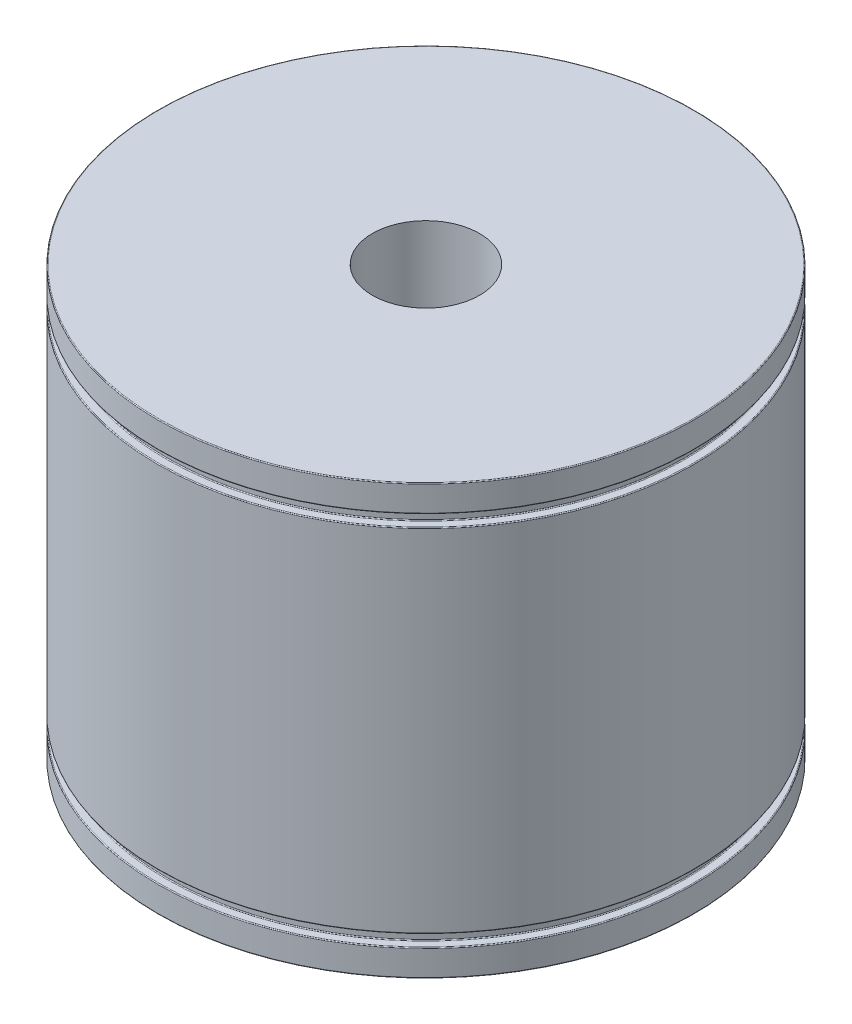
ISO-10303-21;
HEADER;
FILE_DESCRIPTION(('STEP AP214'),'2;1');
FILE_NAME('part.step','',(''),(''),'','','');
FILE_SCHEMA(('AUTOMOTIVE_DESIGN { 1 0 10303 214 1 1 1 1 }'));
ENDSEC;
DATA;
#1=APPLICATION_CONTEXT('core data for automotive mechanical design processes');
#2=APPLICATION_PROTOCOL_DEFINITION('international standard','automotive_design',2000,#1);
#3=PRODUCT_CONTEXT('',#1,'mechanical');
#4=PRODUCT('Part','Part','',(#3));
#5=PRODUCT_RELATED_PRODUCT_CATEGORY('part','',(#4));
#6=PRODUCT_DEFINITION_FORMATION('','',#4);
#7=PRODUCT_DEFINITION_CONTEXT('part definition',#1,'design');
#8=PRODUCT_DEFINITION('design','',#6,#7);
#9=PRODUCT_DEFINITION_SHAPE('','',#8);
#10=(LENGTH_UNIT() NAMED_UNIT(*) SI_UNIT(.MILLI.,.METRE.));
#11=(NAMED_UNIT(*) PLANE_ANGLE_UNIT() SI_UNIT($,.RADIAN.));
#12=(NAMED_UNIT(*) SI_UNIT($,.STERADIAN.) SOLID_ANGLE_UNIT());
#13=UNCERTAINTY_MEASURE_WITH_UNIT(LENGTH_MEASURE(1.E-05),#10,'distance_accuracy_value','');
#14=(GEOMETRIC_REPRESENTATION_CONTEXT(3) GLOBAL_UNCERTAINTY_ASSIGNED_CONTEXT((#13)) GLOBAL_UNIT_ASSIGNED_CONTEXT((#10,
#11,#12)) REPRESENTATION_CONTEXT('',''));
#15=CARTESIAN_POINT('',(0.,0.,0.));
#16=DIRECTION('',(0.,0.,1.));
#17=DIRECTION('',(1.,0.,0.));
#18=AXIS2_PLACEMENT_3D('',#15,#16,#17);
#19=CARTESIAN_POINT('',(6.35000000000001,25.4,0.));
#20=DIRECTION('',(0.,-1.,0.));
#21=DIRECTION('',(0.,0.,-1.));
#22=AXIS2_PLACEMENT_3D('',#19,#20,#21);
#23=PLANE('',#22);
#24=CARTESIAN_POINT('',(0.,25.4,0.));
#25=DIRECTION('',(0.,1.,0.));
#26=DIRECTION('',(0.,0.,1.));
#27=AXIS2_PLACEMENT_3D('',#24,#25,#26);
#28=CIRCLE('',#27,6.35000000000001);
#29=CARTESIAN_POINT('',(0.,25.4,6.35000000000001));
#30=VERTEX_POINT('',#29);
#31=EDGE_CURVE('E111',#30,#30,#28,.T.);
#32=ORIENTED_EDGE('',*,*,#31,.F.);
#33=EDGE_LOOP('',(#32));
#34=FACE_BOUND('',#33,.T.);
#35=CARTESIAN_POINT('',(0.,25.4,0.));
#36=DIRECTION('',(0.,1.,0.));
#37=DIRECTION('',(0.,0.,1.));
#38=AXIS2_PLACEMENT_3D('',#35,#36,#37);
#39=CIRCLE('',#38,31.65);
#40=CARTESIAN_POINT('',(0.,25.4,31.65));
#41=VERTEX_POINT('',#40);
#42=EDGE_CURVE('E12',#41,#41,#39,.T.);
#43=ORIENTED_EDGE('',*,*,#42,.T.);
#44=EDGE_LOOP('',(#43));
#45=FACE_BOUND('',#44,.T.);
#46=ADVANCED_FACE('F41',(#34,#45),#23,.F.);
#47=CARTESIAN_POINT('',(0.,25.3,0.));
#48=DIRECTION('',(0.,1.,0.));
#49=DIRECTION('',(0.,0.,1.));
#50=AXIS2_PLACEMENT_3D('',#47,#48,#49);
#51=TOROIDAL_SURFACE('',#50,31.65,0.100000000000001);
#52=ORIENTED_EDGE('',*,*,#42,.F.);
#53=EDGE_LOOP('',(#52));
#54=FACE_BOUND('',#53,.T.);
#55=CARTESIAN_POINT('',(0.,25.3,0.));
#56=DIRECTION('',(0.,1.,0.));
#57=DIRECTION('',(0.,0.,1.));
#58=AXIS2_PLACEMENT_3D('',#55,#56,#57);
#59=CIRCLE('',#58,31.75);
#60=CARTESIAN_POINT('',(0.,25.3,31.75));
#61=VERTEX_POINT('',#60);
#62=EDGE_CURVE('E47',#61,#61,#59,.T.);
#63=ORIENTED_EDGE('',*,*,#62,.T.);
#64=EDGE_LOOP('',(#63));
#65=FACE_BOUND('',#64,.T.);
#66=ADVANCED_FACE('F118',(#54,#65),#51,.T.);
#67=CARTESIAN_POINT('',(0.,25.4,0.));
#68=DIRECTION('',(0.,1.,0.));
#69=DIRECTION('',(0.,0.,1.));
#70=AXIS2_PLACEMENT_3D('',#67,#68,#69);
#71=CYLINDRICAL_SURFACE('',#70,31.75);
#72=ORIENTED_EDGE('',*,*,#62,.F.);
#73=EDGE_LOOP('',(#72));
#74=FACE_BOUND('',#73,.T.);
#75=CARTESIAN_POINT('',(0.,22.3332876802199,0.));
#76=DIRECTION('',(0.,1.,0.));
#77=DIRECTION('',(0.,0.,1.));
#78=AXIS2_PLACEMENT_3D('',#75,#76,#77);
#79=CIRCLE('',#78,31.75);
#80=CARTESIAN_POINT('',(0.,22.3332876802199,31.75));
#81=VERTEX_POINT('',#80);
#82=EDGE_CURVE('E51',#81,#81,#79,.T.);
#83=ORIENTED_EDGE('',*,*,#82,.T.);
#84=EDGE_LOOP('',(#83));
#85=FACE_BOUND('',#84,.T.);
#86=ADVANCED_FACE('F122',(#74,#85),#71,.T.);
#87=CARTESIAN_POINT('',(0.,22.3332876802199,0.));
#88=DIRECTION('',(0.,1.,0.));
#89=DIRECTION('',(0.,0.,1.));
#90=AXIS2_PLACEMENT_3D('',#87,#88,#89);
#91=TOROIDAL_SURFACE('',#90,31.65,0.0999999999999977);
#92=ORIENTED_EDGE('',*,*,#82,.F.);
#93=EDGE_LOOP('',(#92));
#94=FACE_BOUND('',#93,.T.);
#95=CARTESIAN_POINT('',(0.,22.2332876802199,0.));
#96=DIRECTION('',(0.,1.,0.));
#97=DIRECTION('',(0.,0.,1.));
#98=AXIS2_PLACEMENT_3D('',#95,#96,#97);
#99=CIRCLE('',#98,31.65);
#100=CARTESIAN_POINT('',(0.,22.2332876802199,31.65));
#101=VERTEX_POINT('',#100);
#102=EDGE_CURVE('E55',#101,#101,#99,.T.);
#103=ORIENTED_EDGE('',*,*,#102,.T.);
#104=EDGE_LOOP('',(#103));
#105=FACE_BOUND('',#104,.T.);
#106=ADVANCED_FACE('F127',(#94,#105),#91,.T.);
#107=CARTESIAN_POINT('',(31.65,22.2332876802199,0.));
#108=DIRECTION('',(0.,1.,0.));
#109=DIRECTION('',(0.,0.,1.));
#110=AXIS2_PLACEMENT_3D('',#107,#108,#109);
#111=PLANE('',#110);
#112=ORIENTED_EDGE('',*,*,#102,.F.);
#113=EDGE_LOOP('',(#112));
#114=FACE_BOUND('',#113,.T.);
#115=CARTESIAN_POINT('',(0.,22.2332876802199,0.));
#116=DIRECTION('',(0.,1.,0.));
#117=DIRECTION('',(0.,0.,1.));
#118=AXIS2_PLACEMENT_3D('',#115,#116,#117);
#119=CIRCLE('',#118,30.7986025440302);
#120=CARTESIAN_POINT('',(0.,22.2332876802199,30.7986025440302));
#121=VERTEX_POINT('',#120);
#122=EDGE_CURVE('E60',#121,#121,#119,.T.);
#123=ORIENTED_EDGE('',*,*,#122,.T.);
#124=EDGE_LOOP('',(#123));
#125=FACE_BOUND('',#124,.T.);
#126=ADVANCED_FACE('F133',(#114,#125),#111,.F.);
#127=CARTESIAN_POINT('',(0.,22.1332876802199,0.));
#128=DIRECTION('',(0.,1.,0.));
#129=DIRECTION('',(0.,0.,1.));
#130=AXIS2_PLACEMENT_3D('',#127,#128,#129);
#131=TOROIDAL_SURFACE('',#130,30.7986025440302,0.0999999999999959);
#132=ORIENTED_EDGE('',*,*,#122,.F.);
#133=EDGE_LOOP('',(#132));
#134=FACE_BOUND('',#133,.T.);
#135=CARTESIAN_POINT('',(0.,22.1332876802199,0.));
#136=DIRECTION('',(0.,1.,0.));
#137=DIRECTION('',(0.,0.,1.));
#138=AXIS2_PLACEMENT_3D('',#135,#136,#137);
#139=CIRCLE('',#138,30.6986025440302);
#140=CARTESIAN_POINT('',(0.,22.1332876802199,30.6986025440302));
#141=VERTEX_POINT('',#140);
#142=EDGE_CURVE('E63',#141,#141,#139,.T.);
#143=ORIENTED_EDGE('',*,*,#142,.T.);
#144=EDGE_LOOP('',(#143));
#145=FACE_BOUND('',#144,.T.);
#146=ADVANCED_FACE('F137',(#134,#145),#131,.F.);
#147=CARTESIAN_POINT('',(0.,25.4,0.));
#148=DIRECTION('',(0.,1.,0.));
#149=DIRECTION('',(0.,0.,1.));
#150=AXIS2_PLACEMENT_3D('',#147,#148,#149);
#151=CYLINDRICAL_SURFACE('',#150,30.6986025440302);
#152=ORIENTED_EDGE('',*,*,#142,.F.);
#153=EDGE_LOOP('',(#152));
#154=FACE_BOUND('',#153,.T.);
#155=CARTESIAN_POINT('',(0.,20.9361946855747,0.));
#156=DIRECTION('',(0.,1.,0.));
#157=DIRECTION('',(0.,0.,1.));
#158=AXIS2_PLACEMENT_3D('',#155,#156,#157);
#159=CIRCLE('',#158,30.6986025440302);
#160=CARTESIAN_POINT('',(0.,20.9361946855747,30.6986025440302));
#161=VERTEX_POINT('',#160);
#162=EDGE_CURVE('E66',#161,#161,#159,.T.);
#163=ORIENTED_EDGE('',*,*,#162,.T.);
#164=EDGE_LOOP('',(#163));
#165=FACE_BOUND('',#164,.T.);
#166=ADVANCED_FACE('F141',(#154,#165),#151,.T.);
#167=CARTESIAN_POINT('',(0.,20.9361946855747,0.));
#168=DIRECTION('',(0.,1.,0.));
#169=DIRECTION('',(0.,0.,1.));
#170=AXIS2_PLACEMENT_3D('',#167,#168,#169);
#171=TOROIDAL_SURFACE('',#170,30.7986025440302,0.100000000000001);
#172=ORIENTED_EDGE('',*,*,#162,.F.);
#173=EDGE_LOOP('',(#172));
#174=FACE_BOUND('',#173,.T.);
#175=CARTESIAN_POINT('',(0.,20.8361946855747,0.));
#176=DIRECTION('',(0.,1.,0.));
#177=DIRECTION('',(0.,0.,1.));
#178=AXIS2_PLACEMENT_3D('',#175,#176,#177);
#179=CIRCLE('',#178,30.7986025440302);
#180=CARTESIAN_POINT('',(0.,20.8361946855747,30.7986025440302));
#181=VERTEX_POINT('',#180);
#182=EDGE_CURVE('E69',#181,#181,#179,.T.);
#183=ORIENTED_EDGE('',*,*,#182,.T.);
#184=EDGE_LOOP('',(#183));
#185=FACE_BOUND('',#184,.T.);
#186=ADVANCED_FACE('F145',(#174,#185),#171,.F.);
#187=CARTESIAN_POINT('',(30.7986025440302,20.8361946855747,0.));
#188=DIRECTION('',(0.,-1.,0.));
#189=DIRECTION('',(0.,0.,-1.));
#190=AXIS2_PLACEMENT_3D('',#187,#188,#189);
#191=PLANE('',#190);
#192=ORIENTED_EDGE('',*,*,#182,.F.);
#193=EDGE_LOOP('',(#192));
#194=FACE_BOUND('',#193,.T.);
#195=CARTESIAN_POINT('',(0.,20.8361946855747,0.));
#196=DIRECTION('',(0.,1.,0.));
#197=DIRECTION('',(0.,0.,1.));
#198=AXIS2_PLACEMENT_3D('',#195,#196,#197);
#199=CIRCLE('',#198,31.65);
#200=CARTESIAN_POINT('',(0.,20.8361946855747,31.65));
#201=VERTEX_POINT('',#200);
#202=EDGE_CURVE('E72',#201,#201,#199,.T.);
#203=ORIENTED_EDGE('',*,*,#202,.T.);
#204=EDGE_LOOP('',(#203));
#205=FACE_BOUND('',#204,.T.);
#206=ADVANCED_FACE('F149',(#194,#205),#191,.F.);
#207=CARTESIAN_POINT('',(0.,20.7361946855747,0.));
#208=DIRECTION('',(0.,1.,0.));
#209=DIRECTION('',(0.,0.,1.));
#210=AXIS2_PLACEMENT_3D('',#207,#208,#209);
#211=TOROIDAL_SURFACE('',#210,31.65,0.0999999999999977);
#212=ORIENTED_EDGE('',*,*,#202,.F.);
#213=EDGE_LOOP('',(#212));
#214=FACE_BOUND('',#213,.T.);
#215=CARTESIAN_POINT('',(0.,20.7361946855747,0.));
#216=DIRECTION('',(0.,1.,0.));
#217=DIRECTION('',(0.,0.,1.));
#218=AXIS2_PLACEMENT_3D('',#215,#216,#217);
#219=CIRCLE('',#218,31.75);
#220=CARTESIAN_POINT('',(0.,20.7361946855747,31.75));
#221=VERTEX_POINT('',#220);
#222=EDGE_CURVE('E75',#221,#221,#219,.T.);
#223=ORIENTED_EDGE('',*,*,#222,.T.);
#224=EDGE_LOOP('',(#223));
#225=FACE_BOUND('',#224,.T.);
#226=ADVANCED_FACE('F153',(#214,#225),#211,.T.);
#227=CARTESIAN_POINT('',(0.,25.4,0.));
#228=DIRECTION('',(0.,1.,0.));
#229=DIRECTION('',(0.,0.,1.));
#230=AXIS2_PLACEMENT_3D('',#227,#228,#229);
#231=CYLINDRICAL_SURFACE('',#230,31.75);
#232=ORIENTED_EDGE('',*,*,#222,.F.);
#233=EDGE_LOOP('',(#232));
#234=FACE_BOUND('',#233,.T.);
#235=CARTESIAN_POINT('',(0.,-20.7361946855747,0.));
#236=DIRECTION('',(0.,1.,0.));
#237=DIRECTION('',(0.,0.,1.));
#238=AXIS2_PLACEMENT_3D('',#235,#236,#237);
#239=CIRCLE('',#238,31.75);
#240=CARTESIAN_POINT('',(0.,-20.7361946855747,31.75));
#241=VERTEX_POINT('',#240);
#242=EDGE_CURVE('E78',#241,#241,#239,.T.);
#243=ORIENTED_EDGE('',*,*,#242,.T.);
#244=EDGE_LOOP('',(#243));
#245=FACE_BOUND('',#244,.T.);
#246=ADVANCED_FACE('F157',(#234,#245),#231,.T.);
#247=CARTESIAN_POINT('',(0.,-20.7361946855747,0.));
#248=DIRECTION('',(0.,1.,0.));
#249=DIRECTION('',(0.,0.,1.));
#250=AXIS2_PLACEMENT_3D('',#247,#248,#249);
#251=TOROIDAL_SURFACE('',#250,31.65,0.0999999999999977);
#252=ORIENTED_EDGE('',*,*,#242,.F.);
#253=EDGE_LOOP('',(#252));
#254=FACE_BOUND('',#253,.T.);
#255=CARTESIAN_POINT('',(0.,-20.8361946855747,0.));
#256=DIRECTION('',(0.,1.,0.));
#257=DIRECTION('',(0.,0.,1.));
#258=AXIS2_PLACEMENT_3D('',#255,#256,#257);
#259=CIRCLE('',#258,31.65);
#260=CARTESIAN_POINT('',(0.,-20.8361946855747,31.65));
#261=VERTEX_POINT('',#260);
#262=EDGE_CURVE('E81',#261,#261,#259,.T.);
#263=ORIENTED_EDGE('',*,*,#262,.T.);
#264=EDGE_LOOP('',(#263));
#265=FACE_BOUND('',#264,.T.);
#266=ADVANCED_FACE('F161',(#254,#265),#251,.T.);
#267=CARTESIAN_POINT('',(30.7986025440302,-20.8361946855747,0.));
#268=DIRECTION('',(0.,1.,0.));
#269=DIRECTION('',(0.,0.,1.));
#270=AXIS2_PLACEMENT_3D('',#267,#268,#269);
#271=PLANE('',#270);
#272=ORIENTED_EDGE('',*,*,#262,.F.);
#273=EDGE_LOOP('',(#272));
#274=FACE_BOUND('',#273,.T.);
#275=CARTESIAN_POINT('',(0.,-20.8361946855747,0.));
#276=DIRECTION('',(0.,1.,0.));
#277=DIRECTION('',(0.,0.,1.));
#278=AXIS2_PLACEMENT_3D('',#275,#276,#277);
#279=CIRCLE('',#278,30.7986025440302);
#280=CARTESIAN_POINT('',(0.,-20.8361946855747,30.7986025440302));
#281=VERTEX_POINT('',#280);
#282=EDGE_CURVE('E84',#281,#281,#279,.T.);
#283=ORIENTED_EDGE('',*,*,#282,.T.);
#284=EDGE_LOOP('',(#283));
#285=FACE_BOUND('',#284,.T.);
#286=ADVANCED_FACE('F165',(#274,#285),#271,.F.);
#287=CARTESIAN_POINT('',(0.,-20.9361946855747,0.));
#288=DIRECTION('',(0.,1.,0.));
#289=DIRECTION('',(0.,0.,1.));
#290=AXIS2_PLACEMENT_3D('',#287,#288,#289);
#291=TOROIDAL_SURFACE('',#290,30.7986025440302,0.100000000000001);
#292=ORIENTED_EDGE('',*,*,#282,.F.);
#293=EDGE_LOOP('',(#292));
#294=FACE_BOUND('',#293,.T.);
#295=CARTESIAN_POINT('',(0.,-20.9361946855747,0.));
#296=DIRECTION('',(0.,1.,0.));
#297=DIRECTION('',(0.,0.,1.));
#298=AXIS2_PLACEMENT_3D('',#295,#296,#297);
#299=CIRCLE('',#298,30.6986025440302);
#300=CARTESIAN_POINT('',(0.,-20.9361946855747,30.6986025440302));
#301=VERTEX_POINT('',#300);
#302=EDGE_CURVE('E87',#301,#301,#299,.T.);
#303=ORIENTED_EDGE('',*,*,#302,.T.);
#304=EDGE_LOOP('',(#303));
#305=FACE_BOUND('',#304,.T.);
#306=ADVANCED_FACE('F169',(#294,#305),#291,.F.);
#307=CARTESIAN_POINT('',(0.,25.4,0.));
#308=DIRECTION('',(0.,1.,0.));
#309=DIRECTION('',(0.,0.,1.));
#310=AXIS2_PLACEMENT_3D('',#307,#308,#309);
#311=CYLINDRICAL_SURFACE('',#310,30.6986025440302);
#312=ORIENTED_EDGE('',*,*,#302,.F.);
#313=EDGE_LOOP('',(#312));
#314=FACE_BOUND('',#313,.T.);
#315=CARTESIAN_POINT('',(0.,-22.1332876802199,0.));
#316=DIRECTION('',(0.,1.,0.));
#317=DIRECTION('',(0.,0.,1.));
#318=AXIS2_PLACEMENT_3D('',#315,#316,#317);
#319=CIRCLE('',#318,30.6986025440302);
#320=CARTESIAN_POINT('',(0.,-22.1332876802199,30.6986025440302));
#321=VERTEX_POINT('',#320);
#322=EDGE_CURVE('E90',#321,#321,#319,.T.);
#323=ORIENTED_EDGE('',*,*,#322,.T.);
#324=EDGE_LOOP('',(#323));
#325=FACE_BOUND('',#324,.T.);
#326=ADVANCED_FACE('F173',(#314,#325),#311,.T.);
#327=CARTESIAN_POINT('',(0.,-22.1332876802199,0.));
#328=DIRECTION('',(0.,1.,0.));
#329=DIRECTION('',(0.,0.,1.));
#330=AXIS2_PLACEMENT_3D('',#327,#328,#329);
#331=TOROIDAL_SURFACE('',#330,30.7986025440302,0.0999999999999959);
#332=ORIENTED_EDGE('',*,*,#322,.F.);
#333=EDGE_LOOP('',(#332));
#334=FACE_BOUND('',#333,.T.);
#335=CARTESIAN_POINT('',(0.,-22.2332876802199,0.));
#336=DIRECTION('',(0.,1.,0.));
#337=DIRECTION('',(0.,0.,1.));
#338=AXIS2_PLACEMENT_3D('',#335,#336,#337);
#339=CIRCLE('',#338,30.7986025440302);
#340=CARTESIAN_POINT('',(0.,-22.2332876802199,30.7986025440302));
#341=VERTEX_POINT('',#340);
#342=EDGE_CURVE('E93',#341,#341,#339,.T.);
#343=ORIENTED_EDGE('',*,*,#342,.T.);
#344=EDGE_LOOP('',(#343));
#345=FACE_BOUND('',#344,.T.);
#346=ADVANCED_FACE('F177',(#334,#345),#331,.F.);
#347=CARTESIAN_POINT('',(31.65,-22.2332876802199,0.));
#348=DIRECTION('',(0.,-1.,0.));
#349=DIRECTION('',(0.,0.,-1.));
#350=AXIS2_PLACEMENT_3D('',#347,#348,#349);
#351=PLANE('',#350);
#352=ORIENTED_EDGE('',*,*,#342,.F.);
#353=EDGE_LOOP('',(#352));
#354=FACE_BOUND('',#353,.T.);
#355=CARTESIAN_POINT('',(0.,-22.2332876802199,0.));
#356=DIRECTION('',(0.,1.,0.));
#357=DIRECTION('',(0.,0.,1.));
#358=AXIS2_PLACEMENT_3D('',#355,#356,#357);
#359=CIRCLE('',#358,31.65);
#360=CARTESIAN_POINT('',(0.,-22.2332876802199,31.65));
#361=VERTEX_POINT('',#360);
#362=EDGE_CURVE('E96',#361,#361,#359,.T.);
#363=ORIENTED_EDGE('',*,*,#362,.T.);
#364=EDGE_LOOP('',(#363));
#365=FACE_BOUND('',#364,.T.);
#366=ADVANCED_FACE('F181',(#354,#365),#351,.F.);
#367=CARTESIAN_POINT('',(0.,-22.3332876802199,0.));
#368=DIRECTION('',(0.,1.,0.));
#369=DIRECTION('',(0.,0.,1.));
#370=AXIS2_PLACEMENT_3D('',#367,#368,#369);
#371=TOROIDAL_SURFACE('',#370,31.65,0.0999999999999977);
#372=ORIENTED_EDGE('',*,*,#362,.F.);
#373=EDGE_LOOP('',(#372));
#374=FACE_BOUND('',#373,.T.);
#375=CARTESIAN_POINT('',(0.,-22.3332876802199,0.));
#376=DIRECTION('',(0.,1.,0.));
#377=DIRECTION('',(0.,0.,1.));
#378=AXIS2_PLACEMENT_3D('',#375,#376,#377);
#379=CIRCLE('',#378,31.75);
#380=CARTESIAN_POINT('',(0.,-22.3332876802199,31.75));
#381=VERTEX_POINT('',#380);
#382=EDGE_CURVE('E99',#381,#381,#379,.T.);
#383=ORIENTED_EDGE('',*,*,#382,.T.);
#384=EDGE_LOOP('',(#383));
#385=FACE_BOUND('',#384,.T.);
#386=ADVANCED_FACE('F185',(#374,#385),#371,.T.);
#387=CARTESIAN_POINT('',(0.,25.4,0.));
#388=DIRECTION('',(0.,1.,0.));
#389=DIRECTION('',(0.,0.,1.));
#390=AXIS2_PLACEMENT_3D('',#387,#388,#389);
#391=CYLINDRICAL_SURFACE('',#390,31.75);
#392=ORIENTED_EDGE('',*,*,#382,.F.);
#393=EDGE_LOOP('',(#392));
#394=FACE_BOUND('',#393,.T.);
#395=CARTESIAN_POINT('',(0.,-25.3,0.));
#396=DIRECTION('',(0.,1.,0.));
#397=DIRECTION('',(0.,0.,1.));
#398=AXIS2_PLACEMENT_3D('',#395,#396,#397);
#399=CIRCLE('',#398,31.75);
#400=CARTESIAN_POINT('',(0.,-25.3,31.75));
#401=VERTEX_POINT('',#400);
#402=EDGE_CURVE('E102',#401,#401,#399,.T.);
#403=ORIENTED_EDGE('',*,*,#402,.T.);
#404=EDGE_LOOP('',(#403));
#405=FACE_BOUND('',#404,.T.);
#406=ADVANCED_FACE('F189',(#394,#405),#391,.T.);
#407=CARTESIAN_POINT('',(0.,-25.3,0.));
#408=DIRECTION('',(0.,1.,0.));
#409=DIRECTION('',(0.,0.,1.));
#410=AXIS2_PLACEMENT_3D('',#407,#408,#409);
#411=TOROIDAL_SURFACE('',#410,31.65,0.100000000000001);
#412=ORIENTED_EDGE('',*,*,#402,.F.);
#413=EDGE_LOOP('',(#412));
#414=FACE_BOUND('',#413,.T.);
#415=CARTESIAN_POINT('',(0.,-25.4,0.));
#416=DIRECTION('',(0.,1.,0.));
#417=DIRECTION('',(0.,0.,1.));
#418=AXIS2_PLACEMENT_3D('',#415,#416,#417);
#419=CIRCLE('',#418,31.65);
#420=CARTESIAN_POINT('',(0.,-25.4,31.65));
#421=VERTEX_POINT('',#420);
#422=EDGE_CURVE('E105',#421,#421,#419,.T.);
#423=ORIENTED_EDGE('',*,*,#422,.T.);
#424=EDGE_LOOP('',(#423));
#425=FACE_BOUND('',#424,.T.);
#426=ADVANCED_FACE('F193',(#414,#425),#411,.T.);
#427=CARTESIAN_POINT('',(31.65,-25.4,0.));
#428=DIRECTION('',(0.,1.,0.));
#429=DIRECTION('',(0.,0.,1.));
#430=AXIS2_PLACEMENT_3D('',#427,#428,#429);
#431=PLANE('',#430);
#432=ORIENTED_EDGE('',*,*,#422,.F.);
#433=EDGE_LOOP('',(#432));
#434=FACE_BOUND('',#433,.T.);
#435=CARTESIAN_POINT('',(0.,-25.4,0.));
#436=DIRECTION('',(0.,1.,0.));
#437=DIRECTION('',(0.,0.,1.));
#438=AXIS2_PLACEMENT_3D('',#435,#436,#437);
#439=CIRCLE('',#438,6.35000000000001);
#440=CARTESIAN_POINT('',(0.,-25.4,6.35000000000001));
#441=VERTEX_POINT('',#440);
#442=EDGE_CURVE('E108',#441,#441,#439,.T.);
#443=ORIENTED_EDGE('',*,*,#442,.T.);
#444=EDGE_LOOP('',(#443));
#445=FACE_BOUND('',#444,.T.);
#446=ADVANCED_FACE('F197',(#434,#445),#431,.F.);
#447=CARTESIAN_POINT('',(0.,25.4,0.));
#448=DIRECTION('',(0.,1.,0.));
#449=DIRECTION('',(0.,0.,1.));
#450=AXIS2_PLACEMENT_3D('',#447,#448,#449);
#451=CYLINDRICAL_SURFACE('',#450,6.35000000000001);
#452=ORIENTED_EDGE('',*,*,#442,.F.);
#453=EDGE_LOOP('',(#452));
#454=FACE_BOUND('',#453,.T.);
#455=ORIENTED_EDGE('',*,*,#31,.T.);
#456=EDGE_LOOP('',(#455));
#457=FACE_BOUND('',#456,.T.);
#458=ADVANCED_FACE('F115',(#454,#457),#451,.F.);
#459=CLOSED_SHELL('',(#46,#66,#86,#106,#126,#146,#166,#186,#206,#226,#246,#266,#286,#306,#326,
#346,#366,#386,#406,#426,#446,#458));
#460=MANIFOLD_SOLID_BREP('B2',#459);
#461=ADVANCED_BREP_SHAPE_REPRESENTATION('',(#18,#460),#14);
#462=SHAPE_DEFINITION_REPRESENTATION(#9,#461);
ENDSEC;
END-ISO-10303-21;
